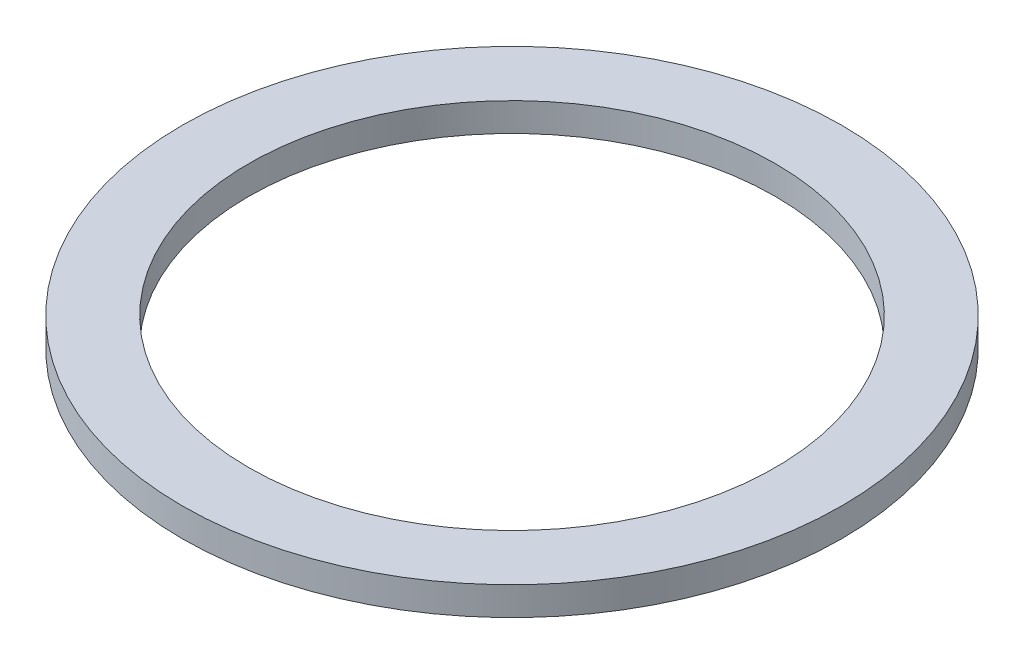
ISO-10303-21;
HEADER;
FILE_DESCRIPTION(('STEP AP214'),'2;1');
FILE_NAME('part.step','',(''),(''),'','','');
FILE_SCHEMA(('AUTOMOTIVE_DESIGN { 1 0 10303 214 1 1 1 1 }'));
ENDSEC;
DATA;
#1=APPLICATION_CONTEXT('core data for automotive mechanical design processes');
#2=APPLICATION_PROTOCOL_DEFINITION('international standard','automotive_design',2000,#1);
#3=PRODUCT_CONTEXT('',#1,'mechanical');
#4=PRODUCT('Part','Part','',(#3));
#5=PRODUCT_RELATED_PRODUCT_CATEGORY('part','',(#4));
#6=PRODUCT_DEFINITION_FORMATION('','',#4);
#7=PRODUCT_DEFINITION_CONTEXT('part definition',#1,'design');
#8=PRODUCT_DEFINITION('design','',#6,#7);
#9=PRODUCT_DEFINITION_SHAPE('','',#8);
#10=(LENGTH_UNIT() NAMED_UNIT(*) SI_UNIT(.MILLI.,.METRE.));
#11=(NAMED_UNIT(*) PLANE_ANGLE_UNIT() SI_UNIT($,.RADIAN.));
#12=(NAMED_UNIT(*) SI_UNIT($,.STERADIAN.) SOLID_ANGLE_UNIT());
#13=UNCERTAINTY_MEASURE_WITH_UNIT(LENGTH_MEASURE(1.E-05),#10,'distance_accuracy_value','');
#14=(GEOMETRIC_REPRESENTATION_CONTEXT(3) GLOBAL_UNCERTAINTY_ASSIGNED_CONTEXT((#13)) GLOBAL_UNIT_ASSIGNED_CONTEXT((#10,
#11,#12)) REPRESENTATION_CONTEXT('',''));
#15=CARTESIAN_POINT('',(0.,0.,0.));
#16=DIRECTION('',(0.,0.,1.));
#17=DIRECTION('',(1.,0.,0.));
#18=AXIS2_PLACEMENT_3D('',#15,#16,#17);
#19=CARTESIAN_POINT('',(139.,0.,0.));
#20=DIRECTION('',(0.,-1.,0.));
#21=DIRECTION('',(0.,0.,-1.));
#22=AXIS2_PLACEMENT_3D('',#19,#20,#21);
#23=PLANE('',#22);
#24=CARTESIAN_POINT('',(0.,0.,0.));
#25=DIRECTION('',(0.,-1.,0.));
#26=DIRECTION('',(0.,0.,-1.));
#27=AXIS2_PLACEMENT_3D('',#24,#25,#26);
#28=CIRCLE('',#27,139.);
#29=CARTESIAN_POINT('',(0.,0.,-139.));
#30=VERTEX_POINT('',#29);
#31=EDGE_CURVE('E197',#30,#30,#28,.T.);
#32=ORIENTED_EDGE('',*,*,#31,.T.);
#33=EDGE_LOOP('',(#32));
#34=FACE_BOUND('',#33,.T.);
#35=CARTESIAN_POINT('',(0.,0.,0.));
#36=DIRECTION('',(0.,-1.,0.));
#37=DIRECTION('',(0.,0.,-1.));
#38=AXIS2_PLACEMENT_3D('',#35,#36,#37);
#39=CIRCLE('',#38,132.937253933194);
#40=CARTESIAN_POINT('',(0.,0.,-132.937253933194));
#41=VERTEX_POINT('',#40);
#42=EDGE_CURVE('E215',#41,#41,#39,.T.);
#43=ORIENTED_EDGE('',*,*,#42,.F.);
#44=EDGE_LOOP('',(#43));
#45=FACE_BOUND('',#44,.T.);
#46=ADVANCED_FACE('F36',(#34,#45),#23,.T.);
#47=CARTESIAN_POINT('',(0.,-1.,0.));
#48=DIRECTION('',(0.,-1.,0.));
#49=DIRECTION('',(0.,0.,-1.));
#50=AXIS2_PLACEMENT_3D('',#47,#48,#49);
#51=TOROIDAL_SURFACE('',#50,125.,8.00000000000001);
#52=ORIENTED_EDGE('',*,*,#42,.T.);
#53=EDGE_LOOP('',(#52));
#54=FACE_BOUND('',#53,.T.);
#55=CARTESIAN_POINT('',(0.,0.,0.));
#56=DIRECTION('',(0.,-1.,0.));
#57=DIRECTION('',(0.,0.,-1.));
#58=AXIS2_PLACEMENT_3D('',#55,#56,#57);
#59=CIRCLE('',#58,117.062746066806);
#60=CARTESIAN_POINT('',(0.,0.,-117.062746066806));
#61=VERTEX_POINT('',#60);
#62=EDGE_CURVE('E211',#61,#61,#59,.T.);
#63=ORIENTED_EDGE('',*,*,#62,.F.);
#64=EDGE_LOOP('',(#63));
#65=FACE_BOUND('',#64,.T.);
#66=ADVANCED_FACE('F278',(#54,#65),#51,.F.);
#67=CARTESIAN_POINT('',(111.,0.,0.));
#68=DIRECTION('',(0.,-1.,0.));
#69=DIRECTION('',(0.,0.,-1.));
#70=AXIS2_PLACEMENT_3D('',#67,#68,#69);
#71=PLANE('',#70);
#72=DIRECTION('',(0.880311811866921,0.,-0.474395524733928));
#73=VECTOR('',#72,1.);
#74=CARTESIAN_POINT('',(-75.2471711310334,0.,81.6018580473323));
#75=LINE('',#74,#73);
#76=CARTESIAN_POINT('',(-79.648730190368,0.,83.973835671002));
#77=VERTEX_POINT('',#76);
#78=CARTESIAN_POINT('',(-75.2471711310334,0.,81.6018580473323));
#79=VERTEX_POINT('',#78);
#80=EDGE_CURVE('E153',#77,#79,#75,.T.);
#81=ORIENTED_EDGE('',*,*,#80,.F.);
#82=DIRECTION('',(-0.47439552473393,0.,-0.88031181186692));
#83=VECTOR('',#82,1.);
#84=CARTESIAN_POINT('',(-79.648730190368,0.,83.973835671002));
#85=LINE('',#84,#83);
#86=CARTESIAN_POINT('',(-78.9371369032671,0.,85.2943033888023));
#87=VERTEX_POINT('',#86);
#88=EDGE_CURVE('E151',#87,#77,#85,.T.);
#89=ORIENTED_EDGE('',*,*,#88,.F.);
#90=DIRECTION('',(-0.880311811866921,0.,0.474395524733927));
#91=VECTOR('',#90,1.);
#92=CARTESIAN_POINT('',(-78.9371369032671,0.,85.2943033888023));
#93=LINE('',#92,#91);
#94=CARTESIAN_POINT('',(-74.070295271341,0.,82.6715873708517));
#95=VERTEX_POINT('',#94);
#96=EDGE_CURVE('E139',#95,#87,#93,.T.);
#97=ORIENTED_EDGE('',*,*,#96,.F.);
#98=CARTESIAN_POINT('',(0.,0.,0.));
#99=DIRECTION('',(0.,-1.,0.));
#100=DIRECTION('',(0.,0.,-1.));
#101=AXIS2_PLACEMENT_3D('',#98,#99,#100);
#102=CIRCLE('',#101,111.);
#103=CARTESIAN_POINT('',(4.16333634234434E-13,0.,111.));
#104=VERTEX_POINT('',#103);
#105=EDGE_CURVE('E212',#104,#95,#102,.T.);
#106=ORIENTED_EDGE('',*,*,#105,.F.);
#107=DIRECTION('',(0.,0.,-1.));
#108=VECTOR('',#107,1.);
#109=CARTESIAN_POINT('',(3.67761376907083E-13,0.,101.));
#110=LINE('',#109,#108);
#111=CARTESIAN_POINT('',(3.67761376907083E-13,0.,101.));
#112=VERTEX_POINT('',#111);
#113=EDGE_CURVE('E160',#104,#112,#110,.T.);
#114=ORIENTED_EDGE('',*,*,#113,.T.);
#115=CARTESIAN_POINT('',(0.,0.,0.));
#116=DIRECTION('',(0.,1.,0.));
#117=DIRECTION('',(0.819152044288993,0.,-0.573576436351044));
#118=AXIS2_PLACEMENT_3D('',#115,#116,#117);
#119=CIRCLE('',#118,101.);
#120=CARTESIAN_POINT('',(8.80273001751385,0.,100.615664507266));
#121=VERTEX_POINT('',#120);
#122=EDGE_CURVE('E155',#112,#121,#119,.T.);
#123=ORIENTED_EDGE('',*,*,#122,.T.);
#124=DIRECTION('',(0.0871557427476625,0.,0.996194698091745));
#125=VECTOR('',#124,1.);
#126=CARTESIAN_POINT('',(8.80273001751385,0.,100.615664507266));
#127=LINE('',#126,#125);
#128=CARTESIAN_POINT('',(9.67428744499048,0.,110.577611488184));
#129=VERTEX_POINT('',#128);
#130=EDGE_CURVE('E167',#121,#129,#127,.T.);
#131=ORIENTED_EDGE('',*,*,#130,.T.);
#132=CARTESIAN_POINT('',(90.9258769160785,0.,63.6669844349656));
#133=VERTEX_POINT('',#132);
#134=EDGE_CURVE('E209',#133,#129,#102,.T.);
#135=ORIENTED_EDGE('',*,*,#134,.F.);
#136=DIRECTION('',(-0.819152044288996,0.,-0.573576436351041));
#137=VECTOR('',#136,1.);
#138=CARTESIAN_POINT('',(82.7343564731885,0.,57.9312200714552));
#139=LINE('',#138,#137);
#140=CARTESIAN_POINT('',(82.7343564731885,0.,57.9312200714552));
#141=VERTEX_POINT('',#140);
#142=EDGE_CURVE('E181',#133,#141,#139,.T.);
#143=ORIENTED_EDGE('',*,*,#142,.T.);
#144=CARTESIAN_POINT('',(0.,0.,0.));
#145=DIRECTION('',(0.,1.,0.));
#146=DIRECTION('',(0.,0.,-1.));
#147=AXIS2_PLACEMENT_3D('',#144,#145,#146);
#148=CIRCLE('',#147,101.);
#149=CARTESIAN_POINT('',(87.4685657822286,0.,50.4999999999995));
#150=VERTEX_POINT('',#149);
#151=EDGE_CURVE('E175',#141,#150,#148,.T.);
#152=ORIENTED_EDGE('',*,*,#151,.T.);
#153=DIRECTION('',(0.866025403784442,0.,0.499999999999995));
#154=VECTOR('',#153,1.);
#155=CARTESIAN_POINT('',(87.4685657822286,0.,50.4999999999995));
#156=LINE('',#155,#154);
#157=CARTESIAN_POINT('',(96.128819820073,0.,55.4999999999994));
#158=VERTEX_POINT('',#157);
#159=EDGE_CURVE('E189',#150,#158,#156,.T.);
#160=ORIENTED_EDGE('',*,*,#159,.T.);
#161=EDGE_CURVE('E208',#79,#158,#102,.T.);
#162=ORIENTED_EDGE('',*,*,#161,.F.);
#163=EDGE_LOOP('',(#81,#89,#97,#106,#114,#123,#131,#135,#143,#152,#160,#162));
#164=FACE_BOUND('',#163,.T.);
#165=ORIENTED_EDGE('',*,*,#62,.T.);
#166=EDGE_LOOP('',(#165));
#167=FACE_BOUND('',#166,.T.);
#168=ADVANCED_FACE('F241',(#164,#167),#71,.T.);
#169=CARTESIAN_POINT('',(0.,4.51102530553271,0.));
#170=DIRECTION('',(0.,-1.,0.));
#171=DIRECTION('',(0.,0.,-1.));
#172=AXIS2_PLACEMENT_3D('',#169,#170,#171);
#173=CYLINDRICAL_SURFACE('',#172,111.);
#174=DIRECTION('',(0.,-1.,0.));
#175=VECTOR('',#174,1.);
#176=CARTESIAN_POINT('',(-75.2471711310334,4.51102530553271,81.6018580473323));
#177=LINE('',#176,#175);
#178=CARTESIAN_POINT('',(-75.2471711310334,9.,81.6018580473323));
#179=VERTEX_POINT('',#178);
#180=EDGE_CURVE('E221',#79,#179,#177,.F.);
#181=ORIENTED_EDGE('',*,*,#180,.F.);
#182=ORIENTED_EDGE('',*,*,#161,.T.);
#183=DIRECTION('',(0.,-1.,0.));
#184=VECTOR('',#183,1.);
#185=CARTESIAN_POINT('',(96.128819820073,4.,55.4999999999994));
#186=LINE('',#185,#184);
#187=CARTESIAN_POINT('',(96.128819820073,4.,55.4999999999994));
#188=VERTEX_POINT('',#187);
#189=EDGE_CURVE('E186',#188,#158,#186,.T.);
#190=ORIENTED_EDGE('',*,*,#189,.F.);
#191=CARTESIAN_POINT('',(0.,4.,0.));
#192=DIRECTION('',(0.,-1.,0.));
#193=DIRECTION('',(0.,0.,-1.));
#194=AXIS2_PLACEMENT_3D('',#191,#192,#193);
#195=CIRCLE('',#194,111.);
#196=CARTESIAN_POINT('',(90.9258769160785,4.,63.6669844349656));
#197=VERTEX_POINT('',#196);
#198=EDGE_CURVE('E180',#188,#197,#195,.T.);
#199=ORIENTED_EDGE('',*,*,#198,.T.);
#200=DIRECTION('',(0.,-1.,0.));
#201=VECTOR('',#200,1.);
#202=CARTESIAN_POINT('',(90.9258769160785,4.,63.6669844349656));
#203=LINE('',#202,#201);
#204=EDGE_CURVE('E194',#197,#133,#203,.T.);
#205=ORIENTED_EDGE('',*,*,#204,.T.);
#206=ORIENTED_EDGE('',*,*,#134,.T.);
#207=DIRECTION('',(0.,-1.,0.));
#208=VECTOR('',#207,1.);
#209=CARTESIAN_POINT('',(9.67428744499048,4.,110.577611488184));
#210=LINE('',#209,#208);
#211=CARTESIAN_POINT('',(9.67428744499048,4.,110.577611488184));
#212=VERTEX_POINT('',#211);
#213=EDGE_CURVE('E164',#212,#129,#210,.T.);
#214=ORIENTED_EDGE('',*,*,#213,.F.);
#215=CARTESIAN_POINT('',(0.,4.,0.));
#216=DIRECTION('',(0.,-1.,0.));
#217=DIRECTION('',(0.819152044288993,0.,-0.573576436351044));
#218=AXIS2_PLACEMENT_3D('',#215,#216,#217);
#219=CIRCLE('',#218,111.);
#220=CARTESIAN_POINT('',(4.12170297892089E-13,4.,111.));
#221=VERTEX_POINT('',#220);
#222=EDGE_CURVE('E159',#212,#221,#219,.T.);
#223=ORIENTED_EDGE('',*,*,#222,.T.);
#224=DIRECTION('',(0.,-1.,0.));
#225=VECTOR('',#224,1.);
#226=CARTESIAN_POINT('',(4.16333634234434E-13,4.,111.));
#227=LINE('',#226,#225);
#228=EDGE_CURVE('E172',#221,#104,#227,.T.);
#229=ORIENTED_EDGE('',*,*,#228,.T.);
#230=ORIENTED_EDGE('',*,*,#105,.T.);
#231=DIRECTION('',(0.,-1.,0.));
#232=VECTOR('',#231,1.);
#233=CARTESIAN_POINT('',(-74.070295271341,4.51102530553271,82.6715873708517));
#234=LINE('',#233,#232);
#235=CARTESIAN_POINT('',(-74.070295271341,9.,82.6715873708517));
#236=VERTEX_POINT('',#235);
#237=EDGE_CURVE('E219',#236,#95,#234,.T.);
#238=ORIENTED_EDGE('',*,*,#237,.F.);
#239=CARTESIAN_POINT('',(0.,9.,0.));
#240=DIRECTION('',(0.,-1.,0.));
#241=DIRECTION('',(0.,0.,-1.));
#242=AXIS2_PLACEMENT_3D('',#239,#240,#241);
#243=CIRCLE('',#242,111.);
#244=EDGE_CURVE('E130',#236,#179,#243,.T.);
#245=ORIENTED_EDGE('',*,*,#244,.T.);
#246=EDGE_LOOP('',(#181,#182,#190,#199,#205,#206,#214,#223,#229,#230,#238,#245));
#247=FACE_BOUND('',#246,.T.);
#248=CARTESIAN_POINT('',(0.,12.,0.));
#249=DIRECTION('',(0.,-1.,0.));
#250=DIRECTION('',(0.,0.,-1.));
#251=AXIS2_PLACEMENT_3D('',#248,#249,#250);
#252=CIRCLE('',#251,111.);
#253=CARTESIAN_POINT('',(0.,12.,-111.));
#254=VERTEX_POINT('',#253);
#255=EDGE_CURVE('E205',#254,#254,#252,.T.);
#256=ORIENTED_EDGE('',*,*,#255,.F.);
#257=EDGE_LOOP('',(#256));
#258=FACE_BOUND('',#257,.T.);
#259=ADVANCED_FACE('F253',(#247,#258),#173,.F.);
#260=CARTESIAN_POINT('',(111.,12.,0.));
#261=DIRECTION('',(0.,1.,0.));
#262=DIRECTION('',(0.,0.,1.));
#263=AXIS2_PLACEMENT_3D('',#260,#261,#262);
#264=PLANE('',#263);
#265=ORIENTED_EDGE('',*,*,#255,.T.);
#266=EDGE_LOOP('',(#265));
#267=FACE_BOUND('',#266,.T.);
#268=CARTESIAN_POINT('',(0.,12.,0.));
#269=DIRECTION('',(0.,-1.,0.));
#270=DIRECTION('',(0.,0.,-1.));
#271=AXIS2_PLACEMENT_3D('',#268,#269,#270);
#272=CIRCLE('',#271,139.);
#273=CARTESIAN_POINT('',(0.,12.,-139.));
#274=VERTEX_POINT('',#273);
#275=EDGE_CURVE('E202',#274,#274,#272,.T.);
#276=ORIENTED_EDGE('',*,*,#275,.F.);
#277=EDGE_LOOP('',(#276));
#278=FACE_BOUND('',#277,.T.);
#279=ADVANCED_FACE('F386',(#267,#278),#264,.T.);
#280=CARTESIAN_POINT('',(0.,4.51102530553271,0.));
#281=DIRECTION('',(0.,-1.,0.));
#282=DIRECTION('',(0.,0.,-1.));
#283=AXIS2_PLACEMENT_3D('',#280,#281,#282);
#284=CYLINDRICAL_SURFACE('',#283,139.);
#285=ORIENTED_EDGE('',*,*,#275,.T.);
#286=EDGE_LOOP('',(#285));
#287=FACE_BOUND('',#286,.T.);
#288=ORIENTED_EDGE('',*,*,#31,.F.);
#289=EDGE_LOOP('',(#288));
#290=FACE_BOUND('',#289,.T.);
#291=ADVANCED_FACE('F348',(#287,#290),#284,.T.);
#292=CARTESIAN_POINT('',(82.7343564731885,4.,57.9312200714552));
#293=DIRECTION('',(-0.573576436351041,0.,0.819152044288996));
#294=DIRECTION('',(0.819152044288996,0.,0.573576436351041));
#295=AXIS2_PLACEMENT_3D('',#292,#293,#294);
#296=PLANE('',#295);
#297=DIRECTION('',(-0.819152044288996,0.,-0.573576436351041));
#298=VECTOR('',#297,1.);
#299=CARTESIAN_POINT('',(82.7343564731885,4.,57.9312200714552));
#300=LINE('',#299,#298);
#301=CARTESIAN_POINT('',(90.7603745942516,4.,63.5510984616311));
#302=VERTEX_POINT('',#301);
#303=EDGE_CURVE('E183',#197,#302,#300,.T.);
#304=ORIENTED_EDGE('',*,*,#303,.T.);
#305=CARTESIAN_POINT('',(90.7603745942516,-10.,63.5510984616311));
#306=DIRECTION('',(-0.573576436351041,0.,0.819152044288996));
#307=DIRECTION('',(0.819152044288996,0.,0.573576436351041));
#308=AXIS2_PLACEMENT_3D('',#305,#306,#307);
#309=CIRCLE('',#308,14.);
#310=EDGE_CURVE('E228',#302,#141,#309,.T.);
#311=ORIENTED_EDGE('',*,*,#310,.T.);
#312=ORIENTED_EDGE('',*,*,#142,.F.);
#313=ORIENTED_EDGE('',*,*,#204,.F.);
#314=EDGE_LOOP('',(#304,#311,#312,#313));
#315=FACE_BOUND('',#314,.T.);
#316=ADVANCED_FACE('F233',(#315),#296,.T.);
#317=CARTESIAN_POINT('',(87.4685657822286,4.,50.4999999999995));
#318=DIRECTION('',(0.499999999999995,0.,-0.866025403784442));
#319=DIRECTION('',(-0.866025403784442,0.,-0.499999999999995));
#320=AXIS2_PLACEMENT_3D('',#317,#318,#319);
#321=PLANE('',#320);
#322=ORIENTED_EDGE('',*,*,#159,.F.);
#323=CARTESIAN_POINT('',(95.9538471564672,-10.,55.3989794855657));
#324=DIRECTION('',(0.499999999999995,0.,-0.866025403784442));
#325=DIRECTION('',(-0.866025403784442,0.,-0.499999999999995));
#326=AXIS2_PLACEMENT_3D('',#323,#324,#325);
#327=CIRCLE('',#326,14.);
#328=CARTESIAN_POINT('',(95.9538471564672,4.,55.3989794855658));
#329=VERTEX_POINT('',#328);
#330=EDGE_CURVE('E224',#150,#329,#327,.T.);
#331=ORIENTED_EDGE('',*,*,#330,.T.);
#332=DIRECTION('',(0.866025403784442,0.,0.499999999999995));
#333=VECTOR('',#332,1.);
#334=CARTESIAN_POINT('',(87.4685657822286,4.,50.4999999999995));
#335=LINE('',#334,#333);
#336=EDGE_CURVE('E178',#329,#188,#335,.T.);
#337=ORIENTED_EDGE('',*,*,#336,.T.);
#338=ORIENTED_EDGE('',*,*,#189,.T.);
#339=EDGE_LOOP('',(#322,#331,#337,#338));
#340=FACE_BOUND('',#339,.T.);
#341=ADVANCED_FACE('F247',(#340),#321,.T.);
#342=CARTESIAN_POINT('',(0.,4.,0.));
#343=DIRECTION('',(0.,-1.,0.));
#344=DIRECTION('',(0.,0.,-1.));
#345=AXIS2_PLACEMENT_3D('',#342,#343,#344);
#346=PLANE('',#345);
#347=ORIENTED_EDGE('',*,*,#336,.F.);
#348=CARTESIAN_POINT('',(0.,4.,0.));
#349=DIRECTION('',(0.,-1.,0.));
#350=DIRECTION('',(0.,0.,-1.));
#351=AXIS2_PLACEMENT_3D('',#348,#349,#350);
#352=CIRCLE('',#351,110.797958971133);
#353=EDGE_CURVE('E226',#329,#302,#352,.T.);
#354=ORIENTED_EDGE('',*,*,#353,.T.);
#355=ORIENTED_EDGE('',*,*,#303,.F.);
#356=ORIENTED_EDGE('',*,*,#198,.F.);
#357=EDGE_LOOP('',(#347,#354,#355,#356));
#358=FACE_BOUND('',#357,.T.);
#359=ADVANCED_FACE('F267',(#358),#346,.F.);
#360=CARTESIAN_POINT('',(3.67761376907083E-13,4.,101.));
#361=DIRECTION('',(-1.,0.,0.));
#362=DIRECTION('',(0.,0.,1.));
#363=AXIS2_PLACEMENT_3D('',#360,#361,#362);
#364=PLANE('',#363);
#365=DIRECTION('',(0.,0.,-1.));
#366=VECTOR('',#365,1.);
#367=CARTESIAN_POINT('',(3.67761376907083E-13,4.,101.));
#368=LINE('',#367,#366);
#369=CARTESIAN_POINT('',(4.920417805249E-13,4.,110.797958971133));
#370=VERTEX_POINT('',#369);
#371=EDGE_CURVE('E162',#221,#370,#368,.T.);
#372=ORIENTED_EDGE('',*,*,#371,.T.);
#373=CARTESIAN_POINT('',(4.920417805249E-13,-10.,110.797958971133));
#374=DIRECTION('',(-1.,0.,0.));
#375=DIRECTION('',(0.,0.,1.));
#376=AXIS2_PLACEMENT_3D('',#373,#374,#375);
#377=CIRCLE('',#376,14.);
#378=EDGE_CURVE('E11',#370,#112,#377,.T.);
#379=ORIENTED_EDGE('',*,*,#378,.T.);
#380=ORIENTED_EDGE('',*,*,#113,.F.);
#381=ORIENTED_EDGE('',*,*,#228,.F.);
#382=EDGE_LOOP('',(#372,#379,#380,#381));
#383=FACE_BOUND('',#382,.T.);
#384=ADVANCED_FACE('F265',(#383),#364,.T.);
#385=CARTESIAN_POINT('',(8.80273001751385,4.,100.615664507266));
#386=DIRECTION('',(0.996194698091745,0.,-0.0871557427476625));
#387=DIRECTION('',(-0.0871557427476625,0.,-0.996194698091745));
#388=AXIS2_PLACEMENT_3D('',#385,#386,#387);
#389=PLANE('',#388);
#390=ORIENTED_EDGE('',*,*,#130,.F.);
#391=CARTESIAN_POINT('',(9.65667840905411,-10.,110.376339286429));
#392=DIRECTION('',(0.996194698091745,0.,-0.0871557427476625));
#393=DIRECTION('',(-0.0871557427476625,0.,-0.996194698091745));
#394=AXIS2_PLACEMENT_3D('',#391,#392,#393);
#395=CIRCLE('',#394,14.);
#396=CARTESIAN_POINT('',(9.65667840905405,4.,110.376339286429));
#397=VERTEX_POINT('',#396);
#398=EDGE_CURVE('E58',#121,#397,#395,.T.);
#399=ORIENTED_EDGE('',*,*,#398,.T.);
#400=DIRECTION('',(0.0871557427476625,0.,0.996194698091745));
#401=VECTOR('',#400,1.);
#402=CARTESIAN_POINT('',(8.80273001751385,4.,100.615664507266));
#403=LINE('',#402,#401);
#404=EDGE_CURVE('E157',#397,#212,#403,.T.);
#405=ORIENTED_EDGE('',*,*,#404,.T.);
#406=ORIENTED_EDGE('',*,*,#213,.T.);
#407=EDGE_LOOP('',(#390,#399,#405,#406));
#408=FACE_BOUND('',#407,.T.);
#409=ADVANCED_FACE('F261',(#408),#389,.T.);
#410=CARTESIAN_POINT('',(0.,4.,0.));
#411=DIRECTION('',(0.,-1.,0.));
#412=DIRECTION('',(0.819152044288993,0.,-0.573576436351044));
#413=AXIS2_PLACEMENT_3D('',#410,#411,#412);
#414=PLANE('',#413);
#415=ORIENTED_EDGE('',*,*,#404,.F.);
#416=CARTESIAN_POINT('',(0.,4.,0.));
#417=DIRECTION('',(0.,-1.,0.));
#418=DIRECTION('',(0.,0.,-1.));
#419=AXIS2_PLACEMENT_3D('',#416,#417,#418);
#420=CIRCLE('',#419,110.797958971133);
#421=EDGE_CURVE('E44',#397,#370,#420,.T.);
#422=ORIENTED_EDGE('',*,*,#421,.T.);
#423=ORIENTED_EDGE('',*,*,#371,.F.);
#424=ORIENTED_EDGE('',*,*,#222,.F.);
#425=EDGE_LOOP('',(#415,#422,#423,#424));
#426=FACE_BOUND('',#425,.T.);
#427=ADVANCED_FACE('F264',(#426),#414,.F.);
#428=CARTESIAN_POINT('',(-75.2471711310334,9.,81.6018580473323));
#429=DIRECTION('',(-0.474395524733928,0.,-0.880311811866921));
#430=DIRECTION('',(-0.880311811866921,0.,0.474395524733928));
#431=AXIS2_PLACEMENT_3D('',#428,#429,#430);
#432=PLANE('',#431);
#433=ORIENTED_EDGE('',*,*,#180,.T.);
#434=DIRECTION('',(0.880311811866922,0.,-0.474395524733926));
#435=VECTOR('',#434,1.);
#436=CARTESIAN_POINT('',(-75.2471711310334,9.,81.6018580473323));
#437=LINE('',#436,#435);
#438=CARTESIAN_POINT('',(-79.648730190368,9.,83.973835671002));
#439=VERTEX_POINT('',#438);
#440=EDGE_CURVE('E133',#439,#179,#437,.T.);
#441=ORIENTED_EDGE('',*,*,#440,.F.);
#442=DIRECTION('',(0.,-1.,0.));
#443=VECTOR('',#442,1.);
#444=CARTESIAN_POINT('',(-79.648730190368,9.,83.973835671002));
#445=LINE('',#444,#443);
#446=EDGE_CURVE('E143',#439,#77,#445,.T.);
#447=ORIENTED_EDGE('',*,*,#446,.T.);
#448=ORIENTED_EDGE('',*,*,#80,.T.);
#449=EDGE_LOOP('',(#433,#441,#447,#448));
#450=FACE_BOUND('',#449,.T.);
#451=ADVANCED_FACE('F299',(#450),#432,.F.);
#452=CARTESIAN_POINT('',(-79.648730190368,9.,83.973835671002));
#453=DIRECTION('',(-0.88031181186692,0.,0.47439552473393));
#454=DIRECTION('',(0.47439552473393,0.,0.88031181186692));
#455=AXIS2_PLACEMENT_3D('',#452,#453,#454);
#456=PLANE('',#455);
#457=ORIENTED_EDGE('',*,*,#88,.T.);
#458=ORIENTED_EDGE('',*,*,#446,.F.);
#459=DIRECTION('',(-0.47439552473393,0.,-0.88031181186692));
#460=VECTOR('',#459,1.);
#461=CARTESIAN_POINT('',(-79.648730190368,9.,83.973835671002));
#462=LINE('',#461,#460);
#463=CARTESIAN_POINT('',(-78.9371369032671,9.,85.2943033888023));
#464=VERTEX_POINT('',#463);
#465=EDGE_CURVE('E128',#464,#439,#462,.T.);
#466=ORIENTED_EDGE('',*,*,#465,.F.);
#467=DIRECTION('',(0.,-1.,0.));
#468=VECTOR('',#467,1.);
#469=CARTESIAN_POINT('',(-78.9371369032671,9.,85.2943033888023));
#470=LINE('',#469,#468);
#471=EDGE_CURVE('E136',#464,#87,#470,.T.);
#472=ORIENTED_EDGE('',*,*,#471,.T.);
#473=EDGE_LOOP('',(#457,#458,#466,#472));
#474=FACE_BOUND('',#473,.T.);
#475=ADVANCED_FACE('F146',(#474),#456,.F.);
#476=CARTESIAN_POINT('',(-78.9371369032671,9.,85.2943033888023));
#477=DIRECTION('',(0.474395524733927,0.,0.880311811866921));
#478=DIRECTION('',(0.880311811866921,0.,-0.474395524733927));
#479=AXIS2_PLACEMENT_3D('',#476,#477,#478);
#480=PLANE('',#479);
#481=ORIENTED_EDGE('',*,*,#237,.T.);
#482=ORIENTED_EDGE('',*,*,#96,.T.);
#483=ORIENTED_EDGE('',*,*,#471,.F.);
#484=DIRECTION('',(-0.880311811866921,0.,0.474395524733927));
#485=VECTOR('',#484,1.);
#486=CARTESIAN_POINT('',(-74.070295271341,9.,82.6715873708517));
#487=LINE('',#486,#485);
#488=EDGE_CURVE('E124',#236,#464,#487,.T.);
#489=ORIENTED_EDGE('',*,*,#488,.F.);
#490=EDGE_LOOP('',(#481,#482,#483,#489));
#491=FACE_BOUND('',#490,.T.);
#492=ADVANCED_FACE('F137',(#491),#480,.F.);
#493=CARTESIAN_POINT('',(0.,9.,0.));
#494=DIRECTION('',(0.,-1.,0.));
#495=DIRECTION('',(0.,0.,-1.));
#496=AXIS2_PLACEMENT_3D('',#493,#494,#495);
#497=PLANE('',#496);
#498=ORIENTED_EDGE('',*,*,#488,.T.);
#499=ORIENTED_EDGE('',*,*,#465,.T.);
#500=ORIENTED_EDGE('',*,*,#440,.T.);
#501=ORIENTED_EDGE('',*,*,#244,.F.);
#502=EDGE_LOOP('',(#498,#499,#500,#501));
#503=FACE_BOUND('',#502,.T.);
#504=ADVANCED_FACE('F126',(#503),#497,.T.);
#505=CARTESIAN_POINT('',(0.,-10.,0.));
#506=DIRECTION('',(0.,-1.,0.));
#507=DIRECTION('',(0.,0.,-1.));
#508=AXIS2_PLACEMENT_3D('',#505,#506,#507);
#509=TOROIDAL_SURFACE('',#508,110.797958971133,14.);
#510=ORIENTED_EDGE('',*,*,#310,.F.);
#511=ORIENTED_EDGE('',*,*,#353,.F.);
#512=ORIENTED_EDGE('',*,*,#330,.F.);
#513=ORIENTED_EDGE('',*,*,#151,.F.);
#514=EDGE_LOOP('',(#510,#511,#512,#513));
#515=FACE_BOUND('',#514,.T.);
#516=ADVANCED_FACE('F243',(#515),#509,.T.);
#517=CARTESIAN_POINT('',(0.,-10.,0.));
#518=DIRECTION('',(0.,-1.,0.));
#519=DIRECTION('',(0.,0.,-1.));
#520=AXIS2_PLACEMENT_3D('',#517,#518,#519);
#521=TOROIDAL_SURFACE('',#520,110.797958971133,14.);
#522=ORIENTED_EDGE('',*,*,#378,.F.);
#523=ORIENTED_EDGE('',*,*,#421,.F.);
#524=ORIENTED_EDGE('',*,*,#398,.F.);
#525=ORIENTED_EDGE('',*,*,#122,.F.);
#526=EDGE_LOOP('',(#522,#523,#524,#525));
#527=FACE_BOUND('',#526,.T.);
#528=ADVANCED_FACE('F38',(#527),#521,.T.);
#529=CLOSED_SHELL('',(#46,#66,#168,#259,#279,#291,#316,#341,#359,#384,#409,#427,#451,#475,#492,
#504,#516,#528));
#530=MANIFOLD_SOLID_BREP('B2',#529);
#531=ADVANCED_BREP_SHAPE_REPRESENTATION('',(#18,#530),#14);
#532=SHAPE_DEFINITION_REPRESENTATION(#9,#531);
ENDSEC;
END-ISO-10303-21;
